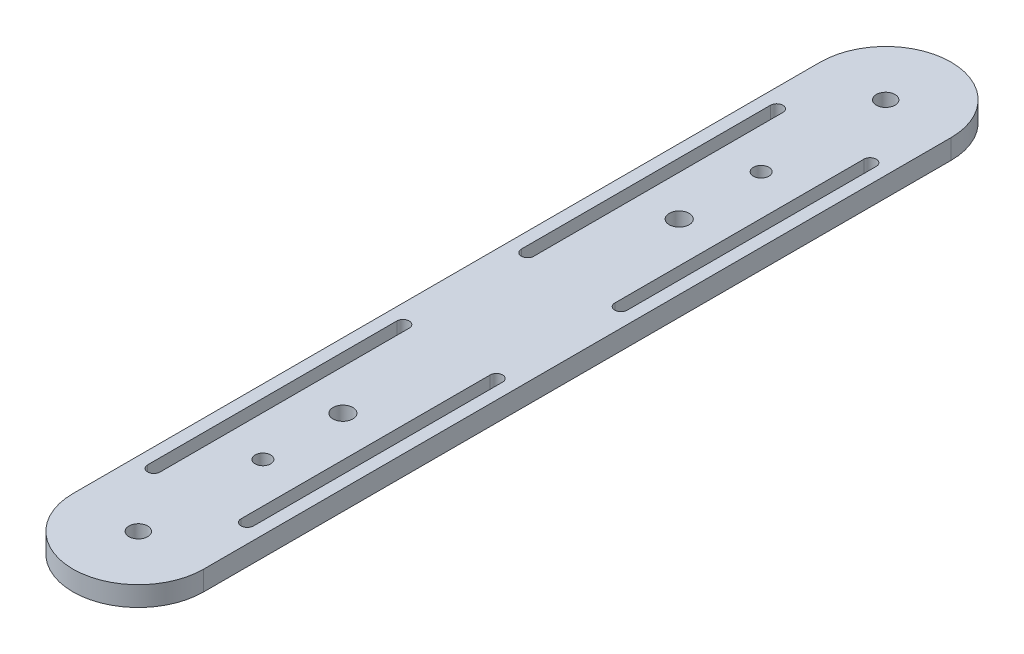
ISO-10303-21;
HEADER;
FILE_DESCRIPTION(('STEP AP214'),'2;1');
FILE_NAME('part.step','',(''),(''),'','','');
FILE_SCHEMA(('AUTOMOTIVE_DESIGN { 1 0 10303 214 1 1 1 1 }'));
ENDSEC;
DATA;
#1=APPLICATION_CONTEXT('core data for automotive mechanical design processes');
#2=APPLICATION_PROTOCOL_DEFINITION('international standard','automotive_design',2000,#1);
#3=PRODUCT_CONTEXT('',#1,'mechanical');
#4=PRODUCT('Part','Part','',(#3));
#5=PRODUCT_RELATED_PRODUCT_CATEGORY('part','',(#4));
#6=PRODUCT_DEFINITION_FORMATION('','',#4);
#7=PRODUCT_DEFINITION_CONTEXT('part definition',#1,'design');
#8=PRODUCT_DEFINITION('design','',#6,#7);
#9=PRODUCT_DEFINITION_SHAPE('','',#8);
#10=(LENGTH_UNIT() NAMED_UNIT(*) SI_UNIT(.MILLI.,.METRE.));
#11=(NAMED_UNIT(*) PLANE_ANGLE_UNIT() SI_UNIT($,.RADIAN.));
#12=(NAMED_UNIT(*) SI_UNIT($,.STERADIAN.) SOLID_ANGLE_UNIT());
#13=UNCERTAINTY_MEASURE_WITH_UNIT(LENGTH_MEASURE(1.E-05),#10,'distance_accuracy_value','');
#14=(GEOMETRIC_REPRESENTATION_CONTEXT(3) GLOBAL_UNCERTAINTY_ASSIGNED_CONTEXT((#13)) GLOBAL_UNIT_ASSIGNED_CONTEXT((#10,
#11,#12)) REPRESENTATION_CONTEXT('',''));
#15=CARTESIAN_POINT('',(0.,0.,0.));
#16=DIRECTION('',(0.,0.,1.));
#17=DIRECTION('',(1.,0.,0.));
#18=AXIS2_PLACEMENT_3D('',#15,#16,#17);
#19=CARTESIAN_POINT('',(0.,3.175,0.));
#20=DIRECTION('',(0.,1.,0.));
#21=DIRECTION('',(0.,0.,1.));
#22=AXIS2_PLACEMENT_3D('',#19,#20,#21);
#23=PLANE('',#22);
#24=CARTESIAN_POINT('',(-7.50000000000002,3.175,70.));
#25=DIRECTION('',(0.,1.,0.));
#26=DIRECTION('',(0.,0.,1.));
#27=AXIS2_PLACEMENT_3D('',#24,#25,#26);
#28=CIRCLE('',#27,0.999999999999999);
#29=CARTESIAN_POINT('',(-6.5,3.175,70.));
#30=VERTEX_POINT('',#29);
#31=CARTESIAN_POINT('',(-8.5,3.175,70.));
#32=VERTEX_POINT('',#31);
#33=EDGE_CURVE('E291',#30,#32,#28,.T.);
#34=ORIENTED_EDGE('',*,*,#33,.F.);
#35=DIRECTION('',(0.,0.,-1.));
#36=VECTOR('',#35,1.);
#37=CARTESIAN_POINT('',(-6.5,3.175,0.));
#38=LINE('',#37,#36);
#39=CARTESIAN_POINT('',(-6.5,3.175,110.));
#40=VERTEX_POINT('',#39);
#41=EDGE_CURVE('E285',#40,#30,#38,.T.);
#42=ORIENTED_EDGE('',*,*,#41,.F.);
#43=CARTESIAN_POINT('',(-7.50000000000013,3.175,110.));
#44=DIRECTION('',(0.,1.,0.));
#45=DIRECTION('',(0.,0.,1.));
#46=AXIS2_PLACEMENT_3D('',#43,#44,#45);
#47=CIRCLE('',#46,0.999999999999999);
#48=CARTESIAN_POINT('',(-8.50000000000013,3.175,110.));
#49=VERTEX_POINT('',#48);
#50=EDGE_CURVE('E287',#49,#40,#47,.T.);
#51=ORIENTED_EDGE('',*,*,#50,.F.);
#52=DIRECTION('',(0.,0.,1.));
#53=VECTOR('',#52,1.);
#54=CARTESIAN_POINT('',(-8.5,3.175,0.));
#55=LINE('',#54,#53);
#56=EDGE_CURVE('E289',#32,#49,#55,.T.);
#57=ORIENTED_EDGE('',*,*,#56,.F.);
#58=EDGE_LOOP('',(#34,#42,#51,#57));
#59=FACE_BOUND('',#58,.T.);
#60=CARTESIAN_POINT('',(7.49999999999986,3.175,110.));
#61=DIRECTION('',(0.,1.,0.));
#62=DIRECTION('',(0.,0.,1.));
#63=AXIS2_PLACEMENT_3D('',#60,#61,#62);
#64=CIRCLE('',#63,0.999999999999999);
#65=CARTESIAN_POINT('',(6.5,3.175,110.));
#66=VERTEX_POINT('',#65);
#67=CARTESIAN_POINT('',(8.5,3.175,110.));
#68=VERTEX_POINT('',#67);
#69=EDGE_CURVE('E283',#66,#68,#64,.T.);
#70=ORIENTED_EDGE('',*,*,#69,.F.);
#71=DIRECTION('',(0.,0.,1.));
#72=VECTOR('',#71,1.);
#73=CARTESIAN_POINT('',(6.5,3.175,0.));
#74=LINE('',#73,#72);
#75=CARTESIAN_POINT('',(6.5,3.175,70.));
#76=VERTEX_POINT('',#75);
#77=EDGE_CURVE('E277',#76,#66,#74,.T.);
#78=ORIENTED_EDGE('',*,*,#77,.F.);
#79=CARTESIAN_POINT('',(7.49999999999997,3.175,70.));
#80=DIRECTION('',(0.,1.,0.));
#81=DIRECTION('',(0.,0.,1.));
#82=AXIS2_PLACEMENT_3D('',#79,#80,#81);
#83=CIRCLE('',#82,0.999999999999999);
#84=CARTESIAN_POINT('',(8.5,3.175,70.));
#85=VERTEX_POINT('',#84);
#86=EDGE_CURVE('E279',#85,#76,#83,.T.);
#87=ORIENTED_EDGE('',*,*,#86,.F.);
#88=DIRECTION('',(0.,0.,-1.));
#89=VECTOR('',#88,1.);
#90=CARTESIAN_POINT('',(8.5,3.175,0.));
#91=LINE('',#90,#89);
#92=EDGE_CURVE('E281',#68,#85,#91,.T.);
#93=ORIENTED_EDGE('',*,*,#92,.F.);
#94=EDGE_LOOP('',(#70,#78,#87,#93));
#95=FACE_BOUND('',#94,.T.);
#96=CARTESIAN_POINT('',(7.5,3.175,50.));
#97=DIRECTION('',(0.,1.,0.));
#98=DIRECTION('',(0.,0.,1.));
#99=AXIS2_PLACEMENT_3D('',#96,#97,#98);
#100=CIRCLE('',#99,0.999999999999999);
#101=CARTESIAN_POINT('',(6.5,3.175,50.));
#102=VERTEX_POINT('',#101);
#103=CARTESIAN_POINT('',(8.5,3.175,50.));
#104=VERTEX_POINT('',#103);
#105=EDGE_CURVE('E275',#102,#104,#100,.T.);
#106=ORIENTED_EDGE('',*,*,#105,.F.);
#107=DIRECTION('',(0.,0.,1.));
#108=VECTOR('',#107,1.);
#109=CARTESIAN_POINT('',(6.5,3.175,0.));
#110=LINE('',#109,#108);
#111=CARTESIAN_POINT('',(6.5,3.175,9.99999999999999));
#112=VERTEX_POINT('',#111);
#113=EDGE_CURVE('E270',#112,#102,#110,.T.);
#114=ORIENTED_EDGE('',*,*,#113,.F.);
#115=CARTESIAN_POINT('',(7.5,3.175,10.));
#116=DIRECTION('',(0.,1.,0.));
#117=DIRECTION('',(0.,0.,1.));
#118=AXIS2_PLACEMENT_3D('',#115,#116,#117);
#119=CIRCLE('',#118,0.999999999999999);
#120=CARTESIAN_POINT('',(8.49999999999999,3.175,10.));
#121=VERTEX_POINT('',#120);
#122=EDGE_CURVE('E178',#121,#112,#119,.T.);
#123=ORIENTED_EDGE('',*,*,#122,.F.);
#124=DIRECTION('',(0.,0.,-1.));
#125=VECTOR('',#124,1.);
#126=CARTESIAN_POINT('',(8.5,3.175,0.));
#127=LINE('',#126,#125);
#128=EDGE_CURVE('E273',#104,#121,#127,.T.);
#129=ORIENTED_EDGE('',*,*,#128,.F.);
#130=EDGE_LOOP('',(#106,#114,#123,#129));
#131=FACE_BOUND('',#130,.T.);
#132=CARTESIAN_POINT('',(-7.5,3.175,50.));
#133=DIRECTION('',(0.,1.,0.));
#134=DIRECTION('',(0.,0.,1.));
#135=AXIS2_PLACEMENT_3D('',#132,#133,#134);
#136=CIRCLE('',#135,0.999999999999999);
#137=CARTESIAN_POINT('',(-8.5,3.175,50.));
#138=VERTEX_POINT('',#137);
#139=CARTESIAN_POINT('',(-6.5,3.175,50.));
#140=VERTEX_POINT('',#139);
#141=EDGE_CURVE('E268',#138,#140,#136,.T.);
#142=ORIENTED_EDGE('',*,*,#141,.F.);
#143=DIRECTION('',(0.,0.,1.));
#144=VECTOR('',#143,1.);
#145=CARTESIAN_POINT('',(-8.5,3.175,0.));
#146=LINE('',#145,#144);
#147=CARTESIAN_POINT('',(-8.5,3.175,10.));
#148=VERTEX_POINT('',#147);
#149=EDGE_CURVE('E255',#148,#138,#146,.T.);
#150=ORIENTED_EDGE('',*,*,#149,.F.);
#151=CARTESIAN_POINT('',(-7.5,3.175,10.));
#152=DIRECTION('',(0.,1.,0.));
#153=DIRECTION('',(0.,0.,1.));
#154=AXIS2_PLACEMENT_3D('',#151,#152,#153);
#155=CIRCLE('',#154,0.999999999999999);
#156=CARTESIAN_POINT('',(-6.5,3.175,9.99999999999999));
#157=VERTEX_POINT('',#156);
#158=EDGE_CURVE('E263',#157,#148,#155,.T.);
#159=ORIENTED_EDGE('',*,*,#158,.F.);
#160=DIRECTION('',(0.,0.,-1.));
#161=VECTOR('',#160,1.);
#162=CARTESIAN_POINT('',(-6.5,3.175,0.));
#163=LINE('',#162,#161);
#164=EDGE_CURVE('E266',#140,#157,#163,.T.);
#165=ORIENTED_EDGE('',*,*,#164,.F.);
#166=EDGE_LOOP('',(#142,#150,#159,#165));
#167=FACE_BOUND('',#166,.T.);
#168=CARTESIAN_POINT('',(-3.53422890929105E-13,3.175,33.1499999999998));
#169=DIRECTION('',(0.,1.,0.));
#170=DIRECTION('',(0.,0.,1.));
#171=AXIS2_PLACEMENT_3D('',#168,#169,#170);
#172=CIRCLE('',#171,1.60000000000027);
#173=CARTESIAN_POINT('',(-3.53422890929105E-13,3.175,34.7500000000001));
#174=VERTEX_POINT('',#173);
#175=EDGE_CURVE('E302',#174,#174,#172,.T.);
#176=ORIENTED_EDGE('',*,*,#175,.F.);
#177=EDGE_LOOP('',(#176));
#178=FACE_BOUND('',#177,.T.);
#179=CARTESIAN_POINT('',(-2.44502963334936E-13,3.175,87.1499999999998));
#180=DIRECTION('',(0.,1.,0.));
#181=DIRECTION('',(0.,0.,1.));
#182=AXIS2_PLACEMENT_3D('',#179,#180,#181);
#183=CIRCLE('',#182,1.60000000000016);
#184=CARTESIAN_POINT('',(-2.44502963334936E-13,3.175,88.75));
#185=VERTEX_POINT('',#184);
#186=EDGE_CURVE('E297',#185,#185,#183,.T.);
#187=ORIENTED_EDGE('',*,*,#186,.F.);
#188=EDGE_LOOP('',(#187));
#189=FACE_BOUND('',#188,.T.);
#190=CARTESIAN_POINT('',(0.,3.175,100.));
#191=DIRECTION('',(0.,1.,0.));
#192=DIRECTION('',(0.,0.,1.));
#193=AXIS2_PLACEMENT_3D('',#190,#191,#192);
#194=CIRCLE('',#193,1.25);
#195=CARTESIAN_POINT('',(0.,3.175,101.25));
#196=VERTEX_POINT('',#195);
#197=EDGE_CURVE('E308',#196,#196,#194,.T.);
#198=ORIENTED_EDGE('',*,*,#197,.F.);
#199=EDGE_LOOP('',(#198));
#200=FACE_BOUND('',#199,.T.);
#201=CARTESIAN_POINT('',(-1.43479954023023E-10,3.175,20.0000000000062));
#202=DIRECTION('',(0.,-1.,0.));
#203=DIRECTION('',(0.,0.,-1.));
#204=AXIS2_PLACEMENT_3D('',#201,#202,#203);
#205=CIRCLE('',#204,1.25);
#206=CARTESIAN_POINT('',(-1.43479954023023E-10,3.175,18.7500000000062));
#207=VERTEX_POINT('',#206);
#208=EDGE_CURVE('E311',#207,#207,#205,.T.);
#209=ORIENTED_EDGE('',*,*,#208,.T.);
#210=EDGE_LOOP('',(#209));
#211=FACE_BOUND('',#210,.T.);
#212=CARTESIAN_POINT('',(0.,3.175,0.));
#213=DIRECTION('',(0.,1.,0.));
#214=DIRECTION('',(0.,0.,1.));
#215=AXIS2_PLACEMENT_3D('',#212,#213,#214);
#216=CIRCLE('',#215,1.5);
#217=CARTESIAN_POINT('',(0.,3.175,1.5));
#218=VERTEX_POINT('',#217);
#219=EDGE_CURVE('E321',#218,#218,#216,.T.);
#220=ORIENTED_EDGE('',*,*,#219,.F.);
#221=EDGE_LOOP('',(#220));
#222=FACE_BOUND('',#221,.T.);
#223=CARTESIAN_POINT('',(0.,3.175,0.));
#224=DIRECTION('',(0.,1.,0.));
#225=DIRECTION('',(0.,0.,1.));
#226=AXIS2_PLACEMENT_3D('',#223,#224,#225);
#227=CIRCLE('',#226,10.5);
#228=CARTESIAN_POINT('',(10.5,3.175,0.));
#229=VERTEX_POINT('',#228);
#230=CARTESIAN_POINT('',(-10.5,3.175,0.));
#231=VERTEX_POINT('',#230);
#232=EDGE_CURVE('E327',#229,#231,#227,.T.);
#233=ORIENTED_EDGE('',*,*,#232,.T.);
#234=DIRECTION('',(0.,0.,1.));
#235=VECTOR('',#234,1.);
#236=CARTESIAN_POINT('',(-10.5,3.175,0.));
#237=LINE('',#236,#235);
#238=CARTESIAN_POINT('',(-10.5,3.175,120.));
#239=VERTEX_POINT('',#238);
#240=EDGE_CURVE('E330',#231,#239,#237,.T.);
#241=ORIENTED_EDGE('',*,*,#240,.T.);
#242=CARTESIAN_POINT('',(0.,3.175,120.));
#243=DIRECTION('',(0.,1.,0.));
#244=DIRECTION('',(0.,0.,1.));
#245=AXIS2_PLACEMENT_3D('',#242,#243,#244);
#246=CIRCLE('',#245,10.5);
#247=CARTESIAN_POINT('',(10.5,3.175,120.));
#248=VERTEX_POINT('',#247);
#249=EDGE_CURVE('E333',#239,#248,#246,.T.);
#250=ORIENTED_EDGE('',*,*,#249,.T.);
#251=DIRECTION('',(0.,0.,-1.));
#252=VECTOR('',#251,1.);
#253=CARTESIAN_POINT('',(10.5,3.175,0.));
#254=LINE('',#253,#252);
#255=EDGE_CURVE('E335',#248,#229,#254,.T.);
#256=ORIENTED_EDGE('',*,*,#255,.T.);
#257=EDGE_LOOP('',(#233,#241,#250,#256));
#258=FACE_BOUND('',#257,.T.);
#259=CARTESIAN_POINT('',(0.,3.175,120.));
#260=DIRECTION('',(0.,1.,0.));
#261=DIRECTION('',(0.,0.,1.));
#262=AXIS2_PLACEMENT_3D('',#259,#260,#261);
#263=CIRCLE('',#262,1.5);
#264=CARTESIAN_POINT('',(0.,3.175,121.5));
#265=VERTEX_POINT('',#264);
#266=EDGE_CURVE('E314',#265,#265,#263,.T.);
#267=ORIENTED_EDGE('',*,*,#266,.F.);
#268=EDGE_LOOP('',(#267));
#269=FACE_BOUND('',#268,.T.);
#270=ADVANCED_FACE('F32',(#59,#95,#131,#167,#178,#189,#200,#211,#222,#258,#269),#23,.T.);
#271=CARTESIAN_POINT('',(0.,0.,0.));
#272=DIRECTION('',(0.,1.,0.));
#273=DIRECTION('',(0.,0.,1.));
#274=AXIS2_PLACEMENT_3D('',#271,#272,#273);
#275=PLANE('',#274);
#276=DIRECTION('',(0.,0.,1.));
#277=VECTOR('',#276,1.);
#278=CARTESIAN_POINT('',(-6.5,0.,70.));
#279=LINE('',#278,#277);
#280=CARTESIAN_POINT('',(-6.5,0.,70.));
#281=VERTEX_POINT('',#280);
#282=CARTESIAN_POINT('',(-6.5,0.,110.));
#283=VERTEX_POINT('',#282);
#284=EDGE_CURVE('E227',#281,#283,#279,.T.);
#285=ORIENTED_EDGE('',*,*,#284,.F.);
#286=CARTESIAN_POINT('',(-7.50000000000002,0.,70.));
#287=DIRECTION('',(0.,-1.,0.));
#288=DIRECTION('',(0.,0.,1.));
#289=AXIS2_PLACEMENT_3D('',#286,#287,#288);
#290=CIRCLE('',#289,0.999999999999999);
#291=CARTESIAN_POINT('',(-8.5,0.,70.));
#292=VERTEX_POINT('',#291);
#293=EDGE_CURVE('E225',#292,#281,#290,.T.);
#294=ORIENTED_EDGE('',*,*,#293,.F.);
#295=DIRECTION('',(0.,0.,-1.));
#296=VECTOR('',#295,1.);
#297=CARTESIAN_POINT('',(-8.5,0.,110.));
#298=LINE('',#297,#296);
#299=CARTESIAN_POINT('',(-8.50000000000013,0.,110.));
#300=VERTEX_POINT('',#299);
#301=EDGE_CURVE('E232',#300,#292,#298,.T.);
#302=ORIENTED_EDGE('',*,*,#301,.F.);
#303=CARTESIAN_POINT('',(-7.50000000000013,0.,110.));
#304=DIRECTION('',(0.,-1.,0.));
#305=DIRECTION('',(0.,0.,1.));
#306=AXIS2_PLACEMENT_3D('',#303,#304,#305);
#307=CIRCLE('',#306,0.999999999999999);
#308=EDGE_CURVE('E229',#283,#300,#307,.T.);
#309=ORIENTED_EDGE('',*,*,#308,.F.);
#310=EDGE_LOOP('',(#285,#294,#302,#309));
#311=FACE_BOUND('',#310,.T.);
#312=DIRECTION('',(0.,0.,-1.));
#313=VECTOR('',#312,1.);
#314=CARTESIAN_POINT('',(6.5,0.,70.));
#315=LINE('',#314,#313);
#316=CARTESIAN_POINT('',(6.5,0.,110.));
#317=VERTEX_POINT('',#316);
#318=CARTESIAN_POINT('',(6.49999999999997,0.,70.));
#319=VERTEX_POINT('',#318);
#320=EDGE_CURVE('E208',#317,#319,#315,.T.);
#321=ORIENTED_EDGE('',*,*,#320,.F.);
#322=CARTESIAN_POINT('',(7.49999999999986,0.,110.));
#323=DIRECTION('',(0.,-1.,0.));
#324=DIRECTION('',(0.,0.,-1.));
#325=AXIS2_PLACEMENT_3D('',#322,#323,#324);
#326=CIRCLE('',#325,0.999999999999999);
#327=CARTESIAN_POINT('',(8.5,0.,110.));
#328=VERTEX_POINT('',#327);
#329=EDGE_CURVE('E206',#328,#317,#326,.T.);
#330=ORIENTED_EDGE('',*,*,#329,.F.);
#331=DIRECTION('',(0.,0.,1.));
#332=VECTOR('',#331,1.);
#333=CARTESIAN_POINT('',(8.5,0.,110.));
#334=LINE('',#333,#332);
#335=CARTESIAN_POINT('',(8.5,0.,70.));
#336=VERTEX_POINT('',#335);
#337=EDGE_CURVE('E214',#336,#328,#334,.T.);
#338=ORIENTED_EDGE('',*,*,#337,.F.);
#339=CARTESIAN_POINT('',(7.49999999999997,0.,70.));
#340=DIRECTION('',(0.,-1.,0.));
#341=DIRECTION('',(0.,0.,-1.));
#342=AXIS2_PLACEMENT_3D('',#339,#340,#341);
#343=CIRCLE('',#342,0.999999999999999);
#344=EDGE_CURVE('E211',#319,#336,#343,.T.);
#345=ORIENTED_EDGE('',*,*,#344,.F.);
#346=EDGE_LOOP('',(#321,#330,#338,#345));
#347=FACE_BOUND('',#346,.T.);
#348=DIRECTION('',(0.,0.,-1.));
#349=VECTOR('',#348,1.);
#350=CARTESIAN_POINT('',(6.5,0.,50.));
#351=LINE('',#350,#349);
#352=CARTESIAN_POINT('',(6.5,0.,50.));
#353=VERTEX_POINT('',#352);
#354=CARTESIAN_POINT('',(6.5,0.,9.99999999999999));
#355=VERTEX_POINT('',#354);
#356=EDGE_CURVE('E186',#353,#355,#351,.T.);
#357=ORIENTED_EDGE('',*,*,#356,.F.);
#358=CARTESIAN_POINT('',(7.5,0.,50.));
#359=DIRECTION('',(0.,-1.,0.));
#360=DIRECTION('',(0.,0.,1.));
#361=AXIS2_PLACEMENT_3D('',#358,#359,#360);
#362=CIRCLE('',#361,0.999999999999999);
#363=CARTESIAN_POINT('',(8.5,0.,50.));
#364=VERTEX_POINT('',#363);
#365=EDGE_CURVE('E191',#364,#353,#362,.T.);
#366=ORIENTED_EDGE('',*,*,#365,.F.);
#367=DIRECTION('',(0.,0.,1.));
#368=VECTOR('',#367,1.);
#369=CARTESIAN_POINT('',(8.5,0.,10.));
#370=LINE('',#369,#368);
#371=CARTESIAN_POINT('',(8.49999999999999,0.,10.));
#372=VERTEX_POINT('',#371);
#373=EDGE_CURVE('E196',#372,#364,#370,.T.);
#374=ORIENTED_EDGE('',*,*,#373,.F.);
#375=CARTESIAN_POINT('',(7.5,0.,10.));
#376=DIRECTION('',(0.,-1.,0.));
#377=DIRECTION('',(0.,0.,1.));
#378=AXIS2_PLACEMENT_3D('',#375,#376,#377);
#379=CIRCLE('',#378,0.999999999999999);
#380=EDGE_CURVE('E175',#355,#372,#379,.T.);
#381=ORIENTED_EDGE('',*,*,#380,.F.);
#382=EDGE_LOOP('',(#357,#366,#374,#381));
#383=FACE_BOUND('',#382,.T.);
#384=DIRECTION('',(0.,0.,-1.));
#385=VECTOR('',#384,1.);
#386=CARTESIAN_POINT('',(-8.5,0.,10.));
#387=LINE('',#386,#385);
#388=CARTESIAN_POINT('',(-8.5,0.,50.));
#389=VERTEX_POINT('',#388);
#390=CARTESIAN_POINT('',(-8.5,0.,10.));
#391=VERTEX_POINT('',#390);
#392=EDGE_CURVE('E243',#389,#391,#387,.T.);
#393=ORIENTED_EDGE('',*,*,#392,.F.);
#394=CARTESIAN_POINT('',(-7.5,0.,50.));
#395=DIRECTION('',(0.,-1.,0.));
#396=DIRECTION('',(0.,0.,-1.));
#397=AXIS2_PLACEMENT_3D('',#394,#395,#396);
#398=CIRCLE('',#397,0.999999999999999);
#399=CARTESIAN_POINT('',(-6.5,0.,50.));
#400=VERTEX_POINT('',#399);
#401=EDGE_CURVE('E203',#400,#389,#398,.T.);
#402=ORIENTED_EDGE('',*,*,#401,.F.);
#403=DIRECTION('',(0.,0.,1.));
#404=VECTOR('',#403,1.);
#405=CARTESIAN_POINT('',(-6.5,0.,50.));
#406=LINE('',#405,#404);
#407=CARTESIAN_POINT('',(-6.5,0.,9.99999999999999));
#408=VERTEX_POINT('',#407);
#409=EDGE_CURVE('E249',#408,#400,#406,.T.);
#410=ORIENTED_EDGE('',*,*,#409,.F.);
#411=CARTESIAN_POINT('',(-7.5,0.,10.));
#412=DIRECTION('',(0.,-1.,0.));
#413=DIRECTION('',(0.,0.,-1.));
#414=AXIS2_PLACEMENT_3D('',#411,#412,#413);
#415=CIRCLE('',#414,0.999999999999999);
#416=EDGE_CURVE('E246',#391,#408,#415,.T.);
#417=ORIENTED_EDGE('',*,*,#416,.F.);
#418=EDGE_LOOP('',(#393,#402,#410,#417));
#419=FACE_BOUND('',#418,.T.);
#420=CARTESIAN_POINT('',(-3.53422890929105E-13,0.,33.1499999999998));
#421=DIRECTION('',(0.,1.,0.));
#422=DIRECTION('',(0.,0.,1.));
#423=AXIS2_PLACEMENT_3D('',#420,#421,#422);
#424=CIRCLE('',#423,1.60000000000027);
#425=CARTESIAN_POINT('',(-3.53422890929105E-13,0.,34.7500000000001));
#426=VERTEX_POINT('',#425);
#427=EDGE_CURVE('E294',#426,#426,#424,.T.);
#428=ORIENTED_EDGE('',*,*,#427,.T.);
#429=EDGE_LOOP('',(#428));
#430=FACE_BOUND('',#429,.T.);
#431=CARTESIAN_POINT('',(-2.44502963334936E-13,0.,87.1499999999998));
#432=DIRECTION('',(0.,1.,0.));
#433=DIRECTION('',(0.,0.,1.));
#434=AXIS2_PLACEMENT_3D('',#431,#432,#433);
#435=CIRCLE('',#434,1.60000000000016);
#436=CARTESIAN_POINT('',(-2.44502963334936E-13,0.,88.75));
#437=VERTEX_POINT('',#436);
#438=EDGE_CURVE('E293',#437,#437,#435,.T.);
#439=ORIENTED_EDGE('',*,*,#438,.T.);
#440=EDGE_LOOP('',(#439));
#441=FACE_BOUND('',#440,.T.);
#442=CARTESIAN_POINT('',(0.,0.,100.));
#443=DIRECTION('',(0.,1.,0.));
#444=DIRECTION('',(0.,0.,1.));
#445=AXIS2_PLACEMENT_3D('',#442,#443,#444);
#446=CIRCLE('',#445,1.25);
#447=CARTESIAN_POINT('',(0.,0.,101.25));
#448=VERTEX_POINT('',#447);
#449=EDGE_CURVE('E305',#448,#448,#446,.T.);
#450=ORIENTED_EDGE('',*,*,#449,.T.);
#451=EDGE_LOOP('',(#450));
#452=FACE_BOUND('',#451,.T.);
#453=CARTESIAN_POINT('',(-1.43479954023023E-10,0.,20.0000000000062));
#454=DIRECTION('',(0.,1.,0.));
#455=DIRECTION('',(0.,0.,1.));
#456=AXIS2_PLACEMENT_3D('',#453,#454,#455);
#457=CIRCLE('',#456,1.25);
#458=CARTESIAN_POINT('',(-1.43479954023023E-10,0.,21.2500000000062));
#459=VERTEX_POINT('',#458);
#460=EDGE_CURVE('E36',#459,#459,#457,.T.);
#461=ORIENTED_EDGE('',*,*,#460,.T.);
#462=EDGE_LOOP('',(#461));
#463=FACE_BOUND('',#462,.T.);
#464=CARTESIAN_POINT('',(0.,0.,0.));
#465=DIRECTION('',(0.,1.,0.));
#466=DIRECTION('',(0.,0.,1.));
#467=AXIS2_PLACEMENT_3D('',#464,#465,#466);
#468=CIRCLE('',#467,10.5);
#469=CARTESIAN_POINT('',(10.5,0.,0.));
#470=VERTEX_POINT('',#469);
#471=CARTESIAN_POINT('',(-10.5,0.,0.));
#472=VERTEX_POINT('',#471);
#473=EDGE_CURVE('E324',#470,#472,#468,.T.);
#474=ORIENTED_EDGE('',*,*,#473,.F.);
#475=DIRECTION('',(0.,0.,-1.));
#476=VECTOR('',#475,1.);
#477=CARTESIAN_POINT('',(10.5,0.,0.));
#478=LINE('',#477,#476);
#479=CARTESIAN_POINT('',(10.5,0.,120.));
#480=VERTEX_POINT('',#479);
#481=EDGE_CURVE('E331',#480,#470,#478,.T.);
#482=ORIENTED_EDGE('',*,*,#481,.F.);
#483=CARTESIAN_POINT('',(0.,0.,120.));
#484=DIRECTION('',(0.,1.,0.));
#485=DIRECTION('',(0.,0.,1.));
#486=AXIS2_PLACEMENT_3D('',#483,#484,#485);
#487=CIRCLE('',#486,10.5);
#488=CARTESIAN_POINT('',(-10.5,0.,120.));
#489=VERTEX_POINT('',#488);
#490=EDGE_CURVE('E342',#489,#480,#487,.T.);
#491=ORIENTED_EDGE('',*,*,#490,.F.);
#492=DIRECTION('',(0.,0.,1.));
#493=VECTOR('',#492,1.);
#494=CARTESIAN_POINT('',(-10.5,0.,0.));
#495=LINE('',#494,#493);
#496=EDGE_CURVE('E340',#472,#489,#495,.T.);
#497=ORIENTED_EDGE('',*,*,#496,.F.);
#498=EDGE_LOOP('',(#474,#482,#491,#497));
#499=FACE_BOUND('',#498,.T.);
#500=CARTESIAN_POINT('',(0.,0.,0.));
#501=DIRECTION('',(0.,1.,0.));
#502=DIRECTION('',(0.,0.,1.));
#503=AXIS2_PLACEMENT_3D('',#500,#501,#502);
#504=CIRCLE('',#503,1.5);
#505=CARTESIAN_POINT('',(0.,0.,1.5));
#506=VERTEX_POINT('',#505);
#507=EDGE_CURVE('E317',#506,#506,#504,.T.);
#508=ORIENTED_EDGE('',*,*,#507,.T.);
#509=EDGE_LOOP('',(#508));
#510=FACE_BOUND('',#509,.T.);
#511=CARTESIAN_POINT('',(0.,0.,120.));
#512=DIRECTION('',(0.,1.,0.));
#513=DIRECTION('',(0.,0.,1.));
#514=AXIS2_PLACEMENT_3D('',#511,#512,#513);
#515=CIRCLE('',#514,1.5);
#516=CARTESIAN_POINT('',(0.,0.,121.5));
#517=VERTEX_POINT('',#516);
#518=EDGE_CURVE('E318',#517,#517,#515,.T.);
#519=ORIENTED_EDGE('',*,*,#518,.T.);
#520=EDGE_LOOP('',(#519));
#521=FACE_BOUND('',#520,.T.);
#522=ADVANCED_FACE('F193',(#311,#347,#383,#419,#430,#441,#452,#463,#499,#510,#521),#275,.F.);
#523=CARTESIAN_POINT('',(0.,3.175,0.));
#524=DIRECTION('',(0.,-1.,0.));
#525=DIRECTION('',(0.,0.,-1.));
#526=AXIS2_PLACEMENT_3D('',#523,#524,#525);
#527=CYLINDRICAL_SURFACE('',#526,10.5);
#528=ORIENTED_EDGE('',*,*,#473,.T.);
#529=DIRECTION('',(0.,-1.,0.));
#530=VECTOR('',#529,1.);
#531=CARTESIAN_POINT('',(-10.5,3.175,0.));
#532=LINE('',#531,#530);
#533=EDGE_CURVE('E11',#231,#472,#532,.T.);
#534=ORIENTED_EDGE('',*,*,#533,.F.);
#535=ORIENTED_EDGE('',*,*,#232,.F.);
#536=DIRECTION('',(0.,-1.,0.));
#537=VECTOR('',#536,1.);
#538=CARTESIAN_POINT('',(10.5,3.175,0.));
#539=LINE('',#538,#537);
#540=EDGE_CURVE('E337',#229,#470,#539,.T.);
#541=ORIENTED_EDGE('',*,*,#540,.T.);
#542=EDGE_LOOP('',(#528,#534,#535,#541));
#543=FACE_BOUND('',#542,.T.);
#544=ADVANCED_FACE('F34',(#543),#527,.T.);
#545=CARTESIAN_POINT('',(-10.5,3.175,0.));
#546=DIRECTION('',(1.,0.,0.));
#547=DIRECTION('',(0.,0.,-1.));
#548=AXIS2_PLACEMENT_3D('',#545,#546,#547);
#549=PLANE('',#548);
#550=ORIENTED_EDGE('',*,*,#496,.T.);
#551=DIRECTION('',(0.,-1.,0.));
#552=VECTOR('',#551,1.);
#553=CARTESIAN_POINT('',(-10.5,3.175,120.));
#554=LINE('',#553,#552);
#555=EDGE_CURVE('E41',#239,#489,#554,.T.);
#556=ORIENTED_EDGE('',*,*,#555,.F.);
#557=ORIENTED_EDGE('',*,*,#240,.F.);
#558=ORIENTED_EDGE('',*,*,#533,.T.);
#559=EDGE_LOOP('',(#550,#556,#557,#558));
#560=FACE_BOUND('',#559,.T.);
#561=ADVANCED_FACE('F371',(#560),#549,.F.);
#562=CARTESIAN_POINT('',(0.,3.175,120.));
#563=DIRECTION('',(0.,-1.,0.));
#564=DIRECTION('',(0.,0.,-1.));
#565=AXIS2_PLACEMENT_3D('',#562,#563,#564);
#566=CYLINDRICAL_SURFACE('',#565,10.5);
#567=ORIENTED_EDGE('',*,*,#490,.T.);
#568=DIRECTION('',(0.,-1.,0.));
#569=VECTOR('',#568,1.);
#570=CARTESIAN_POINT('',(10.5,3.175,120.));
#571=LINE('',#570,#569);
#572=EDGE_CURVE('E347',#248,#480,#571,.T.);
#573=ORIENTED_EDGE('',*,*,#572,.F.);
#574=ORIENTED_EDGE('',*,*,#249,.F.);
#575=ORIENTED_EDGE('',*,*,#555,.T.);
#576=EDGE_LOOP('',(#567,#573,#574,#575));
#577=FACE_BOUND('',#576,.T.);
#578=ADVANCED_FACE('F355',(#577),#566,.T.);
#579=CARTESIAN_POINT('',(10.5,3.175,0.));
#580=DIRECTION('',(-1.,0.,0.));
#581=DIRECTION('',(0.,0.,1.));
#582=AXIS2_PLACEMENT_3D('',#579,#580,#581);
#583=PLANE('',#582);
#584=ORIENTED_EDGE('',*,*,#481,.T.);
#585=ORIENTED_EDGE('',*,*,#540,.F.);
#586=ORIENTED_EDGE('',*,*,#255,.F.);
#587=ORIENTED_EDGE('',*,*,#572,.T.);
#588=EDGE_LOOP('',(#584,#585,#586,#587));
#589=FACE_BOUND('',#588,.T.);
#590=ADVANCED_FACE('F364',(#589),#583,.F.);
#591=CARTESIAN_POINT('',(0.,3.175,0.));
#592=DIRECTION('',(0.,-1.,0.));
#593=DIRECTION('',(0.,0.,-1.));
#594=AXIS2_PLACEMENT_3D('',#591,#592,#593);
#595=CYLINDRICAL_SURFACE('',#594,1.5);
#596=ORIENTED_EDGE('',*,*,#219,.T.);
#597=EDGE_LOOP('',(#596));
#598=FACE_BOUND('',#597,.T.);
#599=ORIENTED_EDGE('',*,*,#507,.F.);
#600=EDGE_LOOP('',(#599));
#601=FACE_BOUND('',#600,.T.);
#602=ADVANCED_FACE('F389',(#598,#601),#595,.F.);
#603=CARTESIAN_POINT('',(0.,3.175,120.));
#604=DIRECTION('',(0.,-1.,0.));
#605=DIRECTION('',(0.,0.,-1.));
#606=AXIS2_PLACEMENT_3D('',#603,#604,#605);
#607=CYLINDRICAL_SURFACE('',#606,1.5);
#608=ORIENTED_EDGE('',*,*,#266,.T.);
#609=EDGE_LOOP('',(#608));
#610=FACE_BOUND('',#609,.T.);
#611=ORIENTED_EDGE('',*,*,#518,.F.);
#612=EDGE_LOOP('',(#611));
#613=FACE_BOUND('',#612,.T.);
#614=ADVANCED_FACE('F396',(#610,#613),#607,.F.);
#615=CARTESIAN_POINT('',(-1.43479954023023E-10,3.175,20.0000000000062));
#616=DIRECTION('',(0.,-1.,0.));
#617=DIRECTION('',(0.,0.,-1.));
#618=AXIS2_PLACEMENT_3D('',#615,#616,#617);
#619=CYLINDRICAL_SURFACE('',#618,1.25);
#620=ORIENTED_EDGE('',*,*,#208,.F.);
#621=EDGE_LOOP('',(#620));
#622=FACE_BOUND('',#621,.T.);
#623=ORIENTED_EDGE('',*,*,#460,.F.);
#624=EDGE_LOOP('',(#623));
#625=FACE_BOUND('',#624,.T.);
#626=ADVANCED_FACE('F401',(#622,#625),#619,.F.);
#627=CARTESIAN_POINT('',(0.,0.,100.));
#628=DIRECTION('',(0.,1.,0.));
#629=DIRECTION('',(0.,0.,1.));
#630=AXIS2_PLACEMENT_3D('',#627,#628,#629);
#631=CYLINDRICAL_SURFACE('',#630,1.25);
#632=ORIENTED_EDGE('',*,*,#197,.T.);
#633=EDGE_LOOP('',(#632));
#634=FACE_BOUND('',#633,.T.);
#635=ORIENTED_EDGE('',*,*,#449,.F.);
#636=EDGE_LOOP('',(#635));
#637=FACE_BOUND('',#636,.T.);
#638=ADVANCED_FACE('F413',(#634,#637),#631,.F.);
#639=CARTESIAN_POINT('',(-2.44502963334936E-13,0.,87.1499999999998));
#640=DIRECTION('',(0.,1.,0.));
#641=DIRECTION('',(0.,0.,1.));
#642=AXIS2_PLACEMENT_3D('',#639,#640,#641);
#643=CYLINDRICAL_SURFACE('',#642,1.60000000000016);
#644=ORIENTED_EDGE('',*,*,#186,.T.);
#645=EDGE_LOOP('',(#644));
#646=FACE_BOUND('',#645,.T.);
#647=ORIENTED_EDGE('',*,*,#438,.F.);
#648=EDGE_LOOP('',(#647));
#649=FACE_BOUND('',#648,.T.);
#650=ADVANCED_FACE('F419',(#646,#649),#643,.F.);
#651=CARTESIAN_POINT('',(-3.53422890929105E-13,0.,33.1499999999998));
#652=DIRECTION('',(0.,1.,0.));
#653=DIRECTION('',(0.,0.,1.));
#654=AXIS2_PLACEMENT_3D('',#651,#652,#653);
#655=CYLINDRICAL_SURFACE('',#654,1.60000000000027);
#656=ORIENTED_EDGE('',*,*,#175,.T.);
#657=EDGE_LOOP('',(#656));
#658=FACE_BOUND('',#657,.T.);
#659=ORIENTED_EDGE('',*,*,#427,.F.);
#660=EDGE_LOOP('',(#659));
#661=FACE_BOUND('',#660,.T.);
#662=ADVANCED_FACE('F423',(#658,#661),#655,.F.);
#663=CARTESIAN_POINT('',(-7.5,40.,50.));
#664=DIRECTION('',(0.,-1.,0.));
#665=DIRECTION('',(0.,0.,-1.));
#666=AXIS2_PLACEMENT_3D('',#663,#664,#665);
#667=CYLINDRICAL_SURFACE('',#666,0.999999999999999);
#668=ORIENTED_EDGE('',*,*,#141,.T.);
#669=DIRECTION('',(0.,-1.,0.));
#670=VECTOR('',#669,1.);
#671=CARTESIAN_POINT('',(-6.5,40.,50.));
#672=LINE('',#671,#670);
#673=EDGE_CURVE('E253',#140,#400,#672,.T.);
#674=ORIENTED_EDGE('',*,*,#673,.T.);
#675=ORIENTED_EDGE('',*,*,#401,.T.);
#676=DIRECTION('',(0.,-1.,0.));
#677=VECTOR('',#676,1.);
#678=CARTESIAN_POINT('',(-8.5,40.,50.));
#679=LINE('',#678,#677);
#680=EDGE_CURVE('E252',#138,#389,#679,.T.);
#681=ORIENTED_EDGE('',*,*,#680,.F.);
#682=EDGE_LOOP('',(#668,#674,#675,#681));
#683=FACE_BOUND('',#682,.T.);
#684=ADVANCED_FACE('F427',(#683),#667,.F.);
#685=CARTESIAN_POINT('',(-6.5,40.,50.));
#686=DIRECTION('',(1.,0.,0.));
#687=DIRECTION('',(0.,0.,-1.));
#688=AXIS2_PLACEMENT_3D('',#685,#686,#687);
#689=PLANE('',#688);
#690=ORIENTED_EDGE('',*,*,#164,.T.);
#691=DIRECTION('',(0.,-1.,0.));
#692=VECTOR('',#691,1.);
#693=CARTESIAN_POINT('',(-6.5,40.,9.99999999999999));
#694=LINE('',#693,#692);
#695=EDGE_CURVE('E256',#157,#408,#694,.T.);
#696=ORIENTED_EDGE('',*,*,#695,.T.);
#697=ORIENTED_EDGE('',*,*,#409,.T.);
#698=ORIENTED_EDGE('',*,*,#673,.F.);
#699=EDGE_LOOP('',(#690,#696,#697,#698));
#700=FACE_BOUND('',#699,.T.);
#701=ADVANCED_FACE('F431',(#700),#689,.F.);
#702=CARTESIAN_POINT('',(-7.5,40.,10.));
#703=DIRECTION('',(0.,-1.,0.));
#704=DIRECTION('',(0.,0.,-1.));
#705=AXIS2_PLACEMENT_3D('',#702,#703,#704);
#706=CYLINDRICAL_SURFACE('',#705,0.999999999999999);
#707=ORIENTED_EDGE('',*,*,#158,.T.);
#708=DIRECTION('',(0.,-1.,0.));
#709=VECTOR('',#708,1.);
#710=CARTESIAN_POINT('',(-8.5,40.,10.));
#711=LINE('',#710,#709);
#712=EDGE_CURVE('E258',#148,#391,#711,.T.);
#713=ORIENTED_EDGE('',*,*,#712,.T.);
#714=ORIENTED_EDGE('',*,*,#416,.T.);
#715=ORIENTED_EDGE('',*,*,#695,.F.);
#716=EDGE_LOOP('',(#707,#713,#714,#715));
#717=FACE_BOUND('',#716,.T.);
#718=ADVANCED_FACE('F437',(#717),#706,.F.);
#719=CARTESIAN_POINT('',(-8.5,40.,10.));
#720=DIRECTION('',(-1.,0.,0.));
#721=DIRECTION('',(0.,0.,1.));
#722=AXIS2_PLACEMENT_3D('',#719,#720,#721);
#723=PLANE('',#722);
#724=ORIENTED_EDGE('',*,*,#149,.T.);
#725=ORIENTED_EDGE('',*,*,#680,.T.);
#726=ORIENTED_EDGE('',*,*,#392,.T.);
#727=ORIENTED_EDGE('',*,*,#712,.F.);
#728=EDGE_LOOP('',(#724,#725,#726,#727));
#729=FACE_BOUND('',#728,.T.);
#730=ADVANCED_FACE('F433',(#729),#723,.F.);
#731=CARTESIAN_POINT('',(7.5,40.,50.));
#732=DIRECTION('',(0.,-1.,0.));
#733=DIRECTION('',(0.,0.,-1.));
#734=AXIS2_PLACEMENT_3D('',#731,#732,#733);
#735=CYLINDRICAL_SURFACE('',#734,0.999999999999999);
#736=ORIENTED_EDGE('',*,*,#105,.T.);
#737=DIRECTION('',(0.,-1.,0.));
#738=VECTOR('',#737,1.);
#739=CARTESIAN_POINT('',(8.5,40.,50.));
#740=LINE('',#739,#738);
#741=EDGE_CURVE('E201',#104,#364,#740,.T.);
#742=ORIENTED_EDGE('',*,*,#741,.T.);
#743=ORIENTED_EDGE('',*,*,#365,.T.);
#744=DIRECTION('',(0.,-1.,0.));
#745=VECTOR('',#744,1.);
#746=CARTESIAN_POINT('',(6.5,40.,50.));
#747=LINE('',#746,#745);
#748=EDGE_CURVE('E182',#102,#353,#747,.T.);
#749=ORIENTED_EDGE('',*,*,#748,.F.);
#750=EDGE_LOOP('',(#736,#742,#743,#749));
#751=FACE_BOUND('',#750,.T.);
#752=ADVANCED_FACE('F436',(#751),#735,.F.);
#753=CARTESIAN_POINT('',(8.5,40.,10.));
#754=DIRECTION('',(1.,0.,0.));
#755=DIRECTION('',(0.,0.,-1.));
#756=AXIS2_PLACEMENT_3D('',#753,#754,#755);
#757=PLANE('',#756);
#758=ORIENTED_EDGE('',*,*,#128,.T.);
#759=DIRECTION('',(0.,-1.,0.));
#760=VECTOR('',#759,1.);
#761=CARTESIAN_POINT('',(8.49999999999999,40.,10.));
#762=LINE('',#761,#760);
#763=EDGE_CURVE('E181',#121,#372,#762,.T.);
#764=ORIENTED_EDGE('',*,*,#763,.T.);
#765=ORIENTED_EDGE('',*,*,#373,.T.);
#766=ORIENTED_EDGE('',*,*,#741,.F.);
#767=EDGE_LOOP('',(#758,#764,#765,#766));
#768=FACE_BOUND('',#767,.T.);
#769=ADVANCED_FACE('F477',(#768),#757,.F.);
#770=CARTESIAN_POINT('',(7.5,40.,10.));
#771=DIRECTION('',(0.,-1.,0.));
#772=DIRECTION('',(0.,0.,-1.));
#773=AXIS2_PLACEMENT_3D('',#770,#771,#772);
#774=CYLINDRICAL_SURFACE('',#773,0.999999999999999);
#775=ORIENTED_EDGE('',*,*,#122,.T.);
#776=DIRECTION('',(0.,-1.,0.));
#777=VECTOR('',#776,1.);
#778=CARTESIAN_POINT('',(6.5,40.,9.99999999999999));
#779=LINE('',#778,#777);
#780=EDGE_CURVE('E170',#112,#355,#779,.T.);
#781=ORIENTED_EDGE('',*,*,#780,.T.);
#782=ORIENTED_EDGE('',*,*,#380,.T.);
#783=ORIENTED_EDGE('',*,*,#763,.F.);
#784=EDGE_LOOP('',(#775,#781,#782,#783));
#785=FACE_BOUND('',#784,.T.);
#786=ADVANCED_FACE('F172',(#785),#774,.F.);
#787=CARTESIAN_POINT('',(6.5,40.,50.));
#788=DIRECTION('',(-1.,0.,0.));
#789=DIRECTION('',(0.,0.,1.));
#790=AXIS2_PLACEMENT_3D('',#787,#788,#789);
#791=PLANE('',#790);
#792=ORIENTED_EDGE('',*,*,#113,.T.);
#793=ORIENTED_EDGE('',*,*,#748,.T.);
#794=ORIENTED_EDGE('',*,*,#356,.T.);
#795=ORIENTED_EDGE('',*,*,#780,.F.);
#796=EDGE_LOOP('',(#792,#793,#794,#795));
#797=FACE_BOUND('',#796,.T.);
#798=ADVANCED_FACE('F187',(#797),#791,.F.);
#799=CARTESIAN_POINT('',(7.49999999999986,40.,110.));
#800=DIRECTION('',(0.,-1.,0.));
#801=DIRECTION('',(0.,0.,-1.));
#802=AXIS2_PLACEMENT_3D('',#799,#800,#801);
#803=CYLINDRICAL_SURFACE('',#802,0.999999999999999);
#804=ORIENTED_EDGE('',*,*,#69,.T.);
#805=DIRECTION('',(0.,-1.,0.));
#806=VECTOR('',#805,1.);
#807=CARTESIAN_POINT('',(8.5,40.,110.));
#808=LINE('',#807,#806);
#809=EDGE_CURVE('E218',#68,#328,#808,.T.);
#810=ORIENTED_EDGE('',*,*,#809,.T.);
#811=ORIENTED_EDGE('',*,*,#329,.T.);
#812=DIRECTION('',(0.,-1.,0.));
#813=VECTOR('',#812,1.);
#814=CARTESIAN_POINT('',(6.5,40.,110.));
#815=LINE('',#814,#813);
#816=EDGE_CURVE('E217',#66,#317,#815,.T.);
#817=ORIENTED_EDGE('',*,*,#816,.F.);
#818=EDGE_LOOP('',(#804,#810,#811,#817));
#819=FACE_BOUND('',#818,.T.);
#820=ADVANCED_FACE('F461',(#819),#803,.F.);
#821=CARTESIAN_POINT('',(8.5,40.,110.));
#822=DIRECTION('',(1.,0.,0.));
#823=DIRECTION('',(0.,0.,-1.));
#824=AXIS2_PLACEMENT_3D('',#821,#822,#823);
#825=PLANE('',#824);
#826=ORIENTED_EDGE('',*,*,#92,.T.);
#827=DIRECTION('',(0.,-1.,0.));
#828=VECTOR('',#827,1.);
#829=CARTESIAN_POINT('',(8.5,40.,70.));
#830=LINE('',#829,#828);
#831=EDGE_CURVE('E220',#85,#336,#830,.T.);
#832=ORIENTED_EDGE('',*,*,#831,.T.);
#833=ORIENTED_EDGE('',*,*,#337,.T.);
#834=ORIENTED_EDGE('',*,*,#809,.F.);
#835=EDGE_LOOP('',(#826,#832,#833,#834));
#836=FACE_BOUND('',#835,.T.);
#837=ADVANCED_FACE('F464',(#836),#825,.F.);
#838=CARTESIAN_POINT('',(7.49999999999997,40.,70.));
#839=DIRECTION('',(0.,-1.,0.));
#840=DIRECTION('',(0.,0.,-1.));
#841=AXIS2_PLACEMENT_3D('',#838,#839,#840);
#842=CYLINDRICAL_SURFACE('',#841,0.999999999999999);
#843=ORIENTED_EDGE('',*,*,#86,.T.);
#844=DIRECTION('',(0.,-1.,0.));
#845=VECTOR('',#844,1.);
#846=CARTESIAN_POINT('',(6.49999999999997,40.,70.));
#847=LINE('',#846,#845);
#848=EDGE_CURVE('E56',#76,#319,#847,.T.);
#849=ORIENTED_EDGE('',*,*,#848,.T.);
#850=ORIENTED_EDGE('',*,*,#344,.T.);
#851=ORIENTED_EDGE('',*,*,#831,.F.);
#852=EDGE_LOOP('',(#843,#849,#850,#851));
#853=FACE_BOUND('',#852,.T.);
#854=ADVANCED_FACE('F468',(#853),#842,.F.);
#855=CARTESIAN_POINT('',(6.5,40.,70.));
#856=DIRECTION('',(-1.,0.,0.));
#857=DIRECTION('',(0.,0.,1.));
#858=AXIS2_PLACEMENT_3D('',#855,#856,#857);
#859=PLANE('',#858);
#860=ORIENTED_EDGE('',*,*,#77,.T.);
#861=ORIENTED_EDGE('',*,*,#816,.T.);
#862=ORIENTED_EDGE('',*,*,#320,.T.);
#863=ORIENTED_EDGE('',*,*,#848,.F.);
#864=EDGE_LOOP('',(#860,#861,#862,#863));
#865=FACE_BOUND('',#864,.T.);
#866=ADVANCED_FACE('F449',(#865),#859,.F.);
#867=CARTESIAN_POINT('',(-7.50000000000002,40.,70.));
#868=DIRECTION('',(0.,-1.,0.));
#869=DIRECTION('',(0.,0.,-1.));
#870=AXIS2_PLACEMENT_3D('',#867,#868,#869);
#871=CYLINDRICAL_SURFACE('',#870,0.999999999999999);
#872=ORIENTED_EDGE('',*,*,#33,.T.);
#873=DIRECTION('',(0.,-1.,0.));
#874=VECTOR('',#873,1.);
#875=CARTESIAN_POINT('',(-8.5,40.,70.));
#876=LINE('',#875,#874);
#877=EDGE_CURVE('E209',#32,#292,#876,.T.);
#878=ORIENTED_EDGE('',*,*,#877,.T.);
#879=ORIENTED_EDGE('',*,*,#293,.T.);
#880=DIRECTION('',(0.,-1.,0.));
#881=VECTOR('',#880,1.);
#882=CARTESIAN_POINT('',(-6.5,40.,70.));
#883=LINE('',#882,#881);
#884=EDGE_CURVE('E235',#30,#281,#883,.T.);
#885=ORIENTED_EDGE('',*,*,#884,.F.);
#886=EDGE_LOOP('',(#872,#878,#879,#885));
#887=FACE_BOUND('',#886,.T.);
#888=ADVANCED_FACE('F445',(#887),#871,.F.);
#889=CARTESIAN_POINT('',(-8.5,40.,110.));
#890=DIRECTION('',(-1.,0.,0.));
#891=DIRECTION('',(0.,0.,1.));
#892=AXIS2_PLACEMENT_3D('',#889,#890,#891);
#893=PLANE('',#892);
#894=ORIENTED_EDGE('',*,*,#56,.T.);
#895=DIRECTION('',(0.,-1.,0.));
#896=VECTOR('',#895,1.);
#897=CARTESIAN_POINT('',(-8.50000000000013,40.,110.));
#898=LINE('',#897,#896);
#899=EDGE_CURVE('E237',#49,#300,#898,.T.);
#900=ORIENTED_EDGE('',*,*,#899,.T.);
#901=ORIENTED_EDGE('',*,*,#301,.T.);
#902=ORIENTED_EDGE('',*,*,#877,.F.);
#903=EDGE_LOOP('',(#894,#900,#901,#902));
#904=FACE_BOUND('',#903,.T.);
#905=ADVANCED_FACE('F448',(#904),#893,.F.);
#906=CARTESIAN_POINT('',(-7.50000000000013,40.,110.));
#907=DIRECTION('',(0.,-1.,0.));
#908=DIRECTION('',(0.,0.,-1.));
#909=AXIS2_PLACEMENT_3D('',#906,#907,#908);
#910=CYLINDRICAL_SURFACE('',#909,0.999999999999999);
#911=ORIENTED_EDGE('',*,*,#50,.T.);
#912=DIRECTION('',(0.,-1.,0.));
#913=VECTOR('',#912,1.);
#914=CARTESIAN_POINT('',(-6.5,40.,110.));
#915=LINE('',#914,#913);
#916=EDGE_CURVE('E48',#40,#283,#915,.T.);
#917=ORIENTED_EDGE('',*,*,#916,.T.);
#918=ORIENTED_EDGE('',*,*,#308,.T.);
#919=ORIENTED_EDGE('',*,*,#899,.F.);
#920=EDGE_LOOP('',(#911,#917,#918,#919));
#921=FACE_BOUND('',#920,.T.);
#922=ADVANCED_FACE('F454',(#921),#910,.F.);
#923=CARTESIAN_POINT('',(-6.5,40.,70.));
#924=DIRECTION('',(1.,0.,0.));
#925=DIRECTION('',(0.,0.,-1.));
#926=AXIS2_PLACEMENT_3D('',#923,#924,#925);
#927=PLANE('',#926);
#928=ORIENTED_EDGE('',*,*,#41,.T.);
#929=ORIENTED_EDGE('',*,*,#884,.T.);
#930=ORIENTED_EDGE('',*,*,#284,.T.);
#931=ORIENTED_EDGE('',*,*,#916,.F.);
#932=EDGE_LOOP('',(#928,#929,#930,#931));
#933=FACE_BOUND('',#932,.T.);
#934=ADVANCED_FACE('F451',(#933),#927,.F.);
#935=CLOSED_SHELL('',(#270,#522,#544,#561,#578,#590,#602,#614,#626,#638,#650,#662,#684,#701,
#718,#730,#752,#769,#786,#798,#820,#837,#854,#866,#888,#905,#922,#934));
#936=MANIFOLD_SOLID_BREP('B2',#935);
#937=ADVANCED_BREP_SHAPE_REPRESENTATION('',(#18,#936),#14);
#938=SHAPE_DEFINITION_REPRESENTATION(#9,#937);
ENDSEC;
END-ISO-10303-21;
